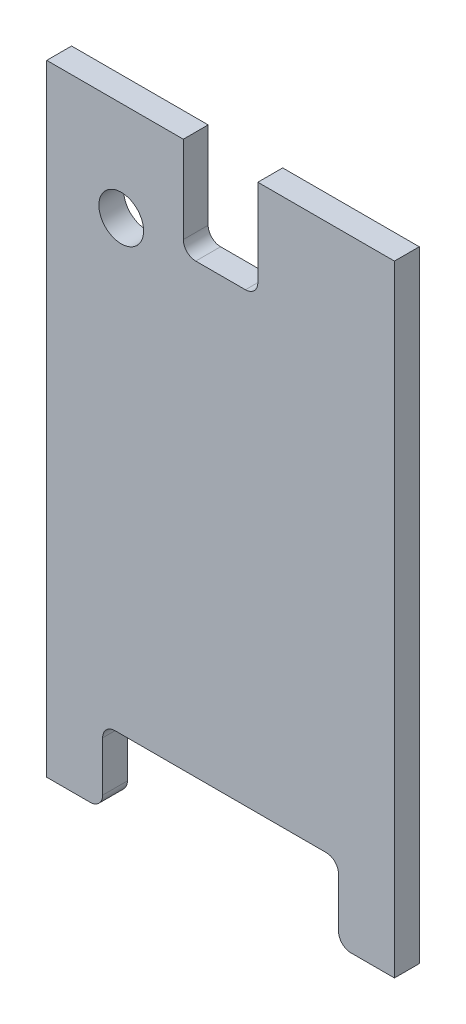
ISO-10303-21;
HEADER;
FILE_DESCRIPTION(('STEP AP214'),'2;1');
FILE_NAME('part.step','',(''),(''),'','','');
FILE_SCHEMA(('AUTOMOTIVE_DESIGN { 1 0 10303 214 1 1 1 1 }'));
ENDSEC;
DATA;
#1=APPLICATION_CONTEXT('core data for automotive mechanical design processes');
#2=APPLICATION_PROTOCOL_DEFINITION('international standard','automotive_design',2000,#1);
#3=PRODUCT_CONTEXT('',#1,'mechanical');
#4=PRODUCT('Part','Part','',(#3));
#5=PRODUCT_RELATED_PRODUCT_CATEGORY('part','',(#4));
#6=PRODUCT_DEFINITION_FORMATION('','',#4);
#7=PRODUCT_DEFINITION_CONTEXT('part definition',#1,'design');
#8=PRODUCT_DEFINITION('design','',#6,#7);
#9=PRODUCT_DEFINITION_SHAPE('','',#8);
#10=(LENGTH_UNIT() NAMED_UNIT(*) SI_UNIT(.MILLI.,.METRE.));
#11=(NAMED_UNIT(*) PLANE_ANGLE_UNIT() SI_UNIT($,.RADIAN.));
#12=(NAMED_UNIT(*) SI_UNIT($,.STERADIAN.) SOLID_ANGLE_UNIT());
#13=UNCERTAINTY_MEASURE_WITH_UNIT(LENGTH_MEASURE(1.E-05),#10,'distance_accuracy_value','');
#14=(GEOMETRIC_REPRESENTATION_CONTEXT(3) GLOBAL_UNCERTAINTY_ASSIGNED_CONTEXT((#13)) GLOBAL_UNIT_ASSIGNED_CONTEXT((#10,
#11,#12)) REPRESENTATION_CONTEXT('',''));
#15=CARTESIAN_POINT('',(0.,0.,0.));
#16=DIRECTION('',(0.,0.,1.));
#17=DIRECTION('',(1.,0.,0.));
#18=AXIS2_PLACEMENT_3D('',#15,#16,#17);
#19=CARTESIAN_POINT('',(18.2478223766306,35.623604775,12.7));
#20=DIRECTION('',(0.,0.,1.));
#21=DIRECTION('',(1.,0.,0.));
#22=AXIS2_PLACEMENT_3D('',#19,#20,#21);
#23=PLANE('',#22);
#24=DIRECTION('',(0.,-1.,0.));
#25=VECTOR('',#24,1.);
#26=CARTESIAN_POINT('',(-3.97717762336947,346.773604775,12.7));
#27=LINE('',#26,#25);
#28=CARTESIAN_POINT('',(-3.97717762336947,346.773604775,12.7));
#29=VERTEX_POINT('',#28);
#30=CARTESIAN_POINT('',(-3.97717762336946,29.273604775,12.7));
#31=VERTEX_POINT('',#30);
#32=EDGE_CURVE('E125',#29,#31,#27,.T.);
#33=ORIENTED_EDGE('',*,*,#32,.T.);
#34=DIRECTION('',(1.,0.,0.));
#35=VECTOR('',#34,1.);
#36=CARTESIAN_POINT('',(-3.97717762336946,29.273604775,12.7));
#37=LINE('',#36,#35);
#38=CARTESIAN_POINT('',(18.2478223766306,29.273604775,12.7));
#39=VERTEX_POINT('',#38);
#40=EDGE_CURVE('E328',#31,#39,#37,.T.);
#41=ORIENTED_EDGE('',*,*,#40,.T.);
#42=CARTESIAN_POINT('',(18.2478223766306,35.623604775,12.7));
#43=DIRECTION('',(0.,0.,1.));
#44=DIRECTION('',(1.,0.,0.));
#45=AXIS2_PLACEMENT_3D('',#42,#43,#44);
#46=CIRCLE('',#45,6.35);
#47=CARTESIAN_POINT('',(24.5978223766306,35.623604775,12.7));
#48=VERTEX_POINT('',#47);
#49=EDGE_CURVE('E275',#39,#48,#46,.T.);
#50=ORIENTED_EDGE('',*,*,#49,.T.);
#51=DIRECTION('',(0.,1.,0.));
#52=VECTOR('',#51,1.);
#53=CARTESIAN_POINT('',(24.5978223766306,35.623604775,12.7));
#54=LINE('',#53,#52);
#55=CARTESIAN_POINT('',(24.5978223766306,61.023604775,12.7));
#56=VERTEX_POINT('',#55);
#57=EDGE_CURVE('E294',#48,#56,#54,.T.);
#58=ORIENTED_EDGE('',*,*,#57,.T.);
#59=CARTESIAN_POINT('',(30.9478223766306,61.023604775,12.7));
#60=DIRECTION('',(0.,0.,-1.));
#61=DIRECTION('',(-1.,0.,0.));
#62=AXIS2_PLACEMENT_3D('',#59,#60,#61);
#63=CIRCLE('',#62,6.35);
#64=CARTESIAN_POINT('',(30.9478223766306,67.373604775,12.7));
#65=VERTEX_POINT('',#64);
#66=EDGE_CURVE('E291',#56,#65,#63,.T.);
#67=ORIENTED_EDGE('',*,*,#66,.T.);
#68=DIRECTION('',(1.,0.,0.));
#69=VECTOR('',#68,1.);
#70=CARTESIAN_POINT('',(30.9478223766306,67.373604775,12.7));
#71=LINE('',#70,#69);
#72=CARTESIAN_POINT('',(138.897822376631,67.373604775,12.7));
#73=VERTEX_POINT('',#72);
#74=EDGE_CURVE('E293',#65,#73,#71,.T.);
#75=ORIENTED_EDGE('',*,*,#74,.T.);
#76=CARTESIAN_POINT('',(138.897822376631,61.023604775,12.7));
#77=DIRECTION('',(0.,0.,-1.));
#78=DIRECTION('',(-1.,0.,0.));
#79=AXIS2_PLACEMENT_3D('',#76,#77,#78);
#80=CIRCLE('',#79,6.34999999999998);
#81=CARTESIAN_POINT('',(145.247822376631,61.023604775,12.7));
#82=VERTEX_POINT('',#81);
#83=EDGE_CURVE('E296',#73,#82,#80,.T.);
#84=ORIENTED_EDGE('',*,*,#83,.T.);
#85=DIRECTION('',(0.,-1.,0.));
#86=VECTOR('',#85,1.);
#87=CARTESIAN_POINT('',(145.247822376631,35.623604775,12.7));
#88=LINE('',#87,#86);
#89=CARTESIAN_POINT('',(145.247822376631,35.623604775,12.7));
#90=VERTEX_POINT('',#89);
#91=EDGE_CURVE('E302',#82,#90,#88,.T.);
#92=ORIENTED_EDGE('',*,*,#91,.T.);
#93=CARTESIAN_POINT('',(151.597822376631,35.623604775,12.7));
#94=DIRECTION('',(0.,0.,1.));
#95=DIRECTION('',(-1.,0.,0.));
#96=AXIS2_PLACEMENT_3D('',#93,#94,#95);
#97=CIRCLE('',#96,6.34999999999998);
#98=CARTESIAN_POINT('',(151.597822376631,29.273604775,12.7));
#99=VERTEX_POINT('',#98);
#100=EDGE_CURVE('E304',#90,#99,#97,.T.);
#101=ORIENTED_EDGE('',*,*,#100,.T.);
#102=DIRECTION('',(1.,0.,0.));
#103=VECTOR('',#102,1.);
#104=CARTESIAN_POINT('',(151.597822376631,29.273604775,12.7));
#105=LINE('',#104,#103);
#106=CARTESIAN_POINT('',(173.822822376631,29.273604775,12.7));
#107=VERTEX_POINT('',#106);
#108=EDGE_CURVE('E306',#99,#107,#105,.T.);
#109=ORIENTED_EDGE('',*,*,#108,.T.);
#110=DIRECTION('',(0.,1.,0.));
#111=VECTOR('',#110,1.);
#112=CARTESIAN_POINT('',(173.822822376631,35.623604775,12.7));
#113=LINE('',#112,#111);
#114=CARTESIAN_POINT('',(173.82282237663,346.773604775,12.7));
#115=VERTEX_POINT('',#114);
#116=EDGE_CURVE('E308',#107,#115,#113,.T.);
#117=ORIENTED_EDGE('',*,*,#116,.T.);
#118=DIRECTION('',(-1.,0.,0.));
#119=VECTOR('',#118,1.);
#120=CARTESIAN_POINT('',(103.972822376631,346.773604775,12.7));
#121=LINE('',#120,#119);
#122=CARTESIAN_POINT('',(103.972822376631,346.773604775,12.7));
#123=VERTEX_POINT('',#122);
#124=EDGE_CURVE('E310',#115,#123,#121,.T.);
#125=ORIENTED_EDGE('',*,*,#124,.T.);
#126=DIRECTION('',(0.,-1.,0.));
#127=VECTOR('',#126,1.);
#128=CARTESIAN_POINT('',(103.972822376631,346.773604775,12.7));
#129=LINE('',#128,#127);
#130=CARTESIAN_POINT('',(103.972822376631,302.323604775,12.7));
#131=VERTEX_POINT('',#130);
#132=EDGE_CURVE('E312',#123,#131,#129,.T.);
#133=ORIENTED_EDGE('',*,*,#132,.T.);
#134=CARTESIAN_POINT('',(97.6228223766306,302.323604775,12.7));
#135=DIRECTION('',(0.,0.,-1.));
#136=DIRECTION('',(1.,0.,0.));
#137=AXIS2_PLACEMENT_3D('',#134,#135,#136);
#138=CIRCLE('',#137,6.35000000000001);
#139=CARTESIAN_POINT('',(97.6228223766306,295.973604775,12.7));
#140=VERTEX_POINT('',#139);
#141=EDGE_CURVE('E314',#131,#140,#138,.T.);
#142=ORIENTED_EDGE('',*,*,#141,.T.);
#143=DIRECTION('',(-1.,0.,0.));
#144=VECTOR('',#143,1.);
#145=CARTESIAN_POINT('',(72.2228223766305,295.973604775,12.7));
#146=LINE('',#145,#144);
#147=CARTESIAN_POINT('',(72.2228223766305,295.973604775,12.7));
#148=VERTEX_POINT('',#147);
#149=EDGE_CURVE('E175',#140,#148,#146,.T.);
#150=ORIENTED_EDGE('',*,*,#149,.T.);
#151=CARTESIAN_POINT('',(72.2228223766305,302.323604775,12.7));
#152=DIRECTION('',(0.,0.,-1.));
#153=DIRECTION('',(1.,0.,0.));
#154=AXIS2_PLACEMENT_3D('',#151,#152,#153);
#155=CIRCLE('',#154,6.35000000000001);
#156=CARTESIAN_POINT('',(65.8728223766305,302.323604775,12.7));
#157=VERTEX_POINT('',#156);
#158=EDGE_CURVE('E169',#148,#157,#155,.T.);
#159=ORIENTED_EDGE('',*,*,#158,.T.);
#160=DIRECTION('',(0.,1.,0.));
#161=VECTOR('',#160,1.);
#162=CARTESIAN_POINT('',(65.8728223766305,346.773604775,12.7));
#163=LINE('',#162,#161);
#164=CARTESIAN_POINT('',(65.8728223766305,346.773604775,12.7));
#165=VERTEX_POINT('',#164);
#166=EDGE_CURVE('E173',#157,#165,#163,.T.);
#167=ORIENTED_EDGE('',*,*,#166,.T.);
#168=DIRECTION('',(-1.,0.,0.));
#169=VECTOR('',#168,1.);
#170=CARTESIAN_POINT('',(-3.97717762336947,346.773604775,12.7));
#171=LINE('',#170,#169);
#172=EDGE_CURVE('E53',#165,#29,#171,.T.);
#173=ORIENTED_EDGE('',*,*,#172,.T.);
#174=EDGE_LOOP('',(#33,#41,#50,#58,#67,#75,#84,#92,#101,#109,#117,#125,#133,#142,#150,#159,#167,#173));
#175=FACE_BOUND('',#174,.T.);
#176=CARTESIAN_POINT('',(34.1228223766306,295.973604775,12.7));
#177=DIRECTION('',(0.,0.,1.));
#178=DIRECTION('',(1.,0.,0.));
#179=AXIS2_PLACEMENT_3D('',#176,#177,#178);
#180=CIRCLE('',#179,11.43);
#181=CARTESIAN_POINT('',(45.5528223766306,295.973604775,12.7));
#182=VERTEX_POINT('',#181);
#183=EDGE_CURVE('E195',#182,#182,#180,.T.);
#184=ORIENTED_EDGE('',*,*,#183,.F.);
#185=EDGE_LOOP('',(#184));
#186=FACE_BOUND('',#185,.T.);
#187=ADVANCED_FACE('F36',(#175,#186),#23,.T.);
#188=CARTESIAN_POINT('',(18.2478223766306,35.623604775,0.));
#189=DIRECTION('',(0.,0.,1.));
#190=DIRECTION('',(1.,0.,0.));
#191=AXIS2_PLACEMENT_3D('',#188,#189,#190);
#192=PLANE('',#191);
#193=DIRECTION('',(0.,-1.,0.));
#194=VECTOR('',#193,1.);
#195=CARTESIAN_POINT('',(-3.97717762336946,35.623604775,0.));
#196=LINE('',#195,#194);
#197=CARTESIAN_POINT('',(-3.97717762336947,346.773604775,0.));
#198=VERTEX_POINT('',#197);
#199=CARTESIAN_POINT('',(-3.97717762336946,29.273604775,0.));
#200=VERTEX_POINT('',#199);
#201=EDGE_CURVE('E119',#198,#200,#196,.T.);
#202=ORIENTED_EDGE('',*,*,#201,.F.);
#203=DIRECTION('',(-1.,0.,0.));
#204=VECTOR('',#203,1.);
#205=CARTESIAN_POINT('',(-3.97717762336947,346.773604775,0.));
#206=LINE('',#205,#204);
#207=CARTESIAN_POINT('',(65.8728223766305,346.773604775,0.));
#208=VERTEX_POINT('',#207);
#209=EDGE_CURVE('E227',#208,#198,#206,.T.);
#210=ORIENTED_EDGE('',*,*,#209,.F.);
#211=DIRECTION('',(0.,1.,0.));
#212=VECTOR('',#211,1.);
#213=CARTESIAN_POINT('',(65.8728223766305,346.773604775,0.));
#214=LINE('',#213,#212);
#215=CARTESIAN_POINT('',(65.8728223766305,302.323604775,0.));
#216=VERTEX_POINT('',#215);
#217=EDGE_CURVE('E112',#216,#208,#214,.T.);
#218=ORIENTED_EDGE('',*,*,#217,.F.);
#219=CARTESIAN_POINT('',(72.2228223766305,302.323604775,0.));
#220=DIRECTION('',(0.,0.,-1.));
#221=DIRECTION('',(1.,0.,0.));
#222=AXIS2_PLACEMENT_3D('',#219,#220,#221);
#223=CIRCLE('',#222,6.35000000000001);
#224=CARTESIAN_POINT('',(72.2228223766305,295.973604775,0.));
#225=VERTEX_POINT('',#224);
#226=EDGE_CURVE('E183',#225,#216,#223,.T.);
#227=ORIENTED_EDGE('',*,*,#226,.F.);
#228=DIRECTION('',(-1.,0.,0.));
#229=VECTOR('',#228,1.);
#230=CARTESIAN_POINT('',(72.2228223766305,295.973604775,0.));
#231=LINE('',#230,#229);
#232=CARTESIAN_POINT('',(97.6228223766306,295.973604775,0.));
#233=VERTEX_POINT('',#232);
#234=EDGE_CURVE('E223',#233,#225,#231,.T.);
#235=ORIENTED_EDGE('',*,*,#234,.F.);
#236=CARTESIAN_POINT('',(97.6228223766306,302.323604775,0.));
#237=DIRECTION('',(0.,0.,-1.));
#238=DIRECTION('',(1.,0.,0.));
#239=AXIS2_PLACEMENT_3D('',#236,#237,#238);
#240=CIRCLE('',#239,6.35000000000001);
#241=CARTESIAN_POINT('',(103.972822376631,302.323604775,0.));
#242=VERTEX_POINT('',#241);
#243=EDGE_CURVE('E221',#242,#233,#240,.T.);
#244=ORIENTED_EDGE('',*,*,#243,.F.);
#245=DIRECTION('',(0.,-1.,0.));
#246=VECTOR('',#245,1.);
#247=CARTESIAN_POINT('',(103.972822376631,346.773604775,0.));
#248=LINE('',#247,#246);
#249=CARTESIAN_POINT('',(103.972822376631,346.773604775,0.));
#250=VERTEX_POINT('',#249);
#251=EDGE_CURVE('E219',#250,#242,#248,.T.);
#252=ORIENTED_EDGE('',*,*,#251,.F.);
#253=DIRECTION('',(-1.,0.,0.));
#254=VECTOR('',#253,1.);
#255=CARTESIAN_POINT('',(103.972822376631,346.773604775,0.));
#256=LINE('',#255,#254);
#257=CARTESIAN_POINT('',(173.82282237663,346.773604775,0.));
#258=VERTEX_POINT('',#257);
#259=EDGE_CURVE('E217',#258,#250,#256,.T.);
#260=ORIENTED_EDGE('',*,*,#259,.F.);
#261=DIRECTION('',(0.,1.,0.));
#262=VECTOR('',#261,1.);
#263=CARTESIAN_POINT('',(173.82282237663,346.773604775,0.));
#264=LINE('',#263,#262);
#265=CARTESIAN_POINT('',(173.822822376631,29.273604775,0.));
#266=VERTEX_POINT('',#265);
#267=EDGE_CURVE('E215',#266,#258,#264,.T.);
#268=ORIENTED_EDGE('',*,*,#267,.F.);
#269=DIRECTION('',(1.,0.,0.));
#270=VECTOR('',#269,1.);
#271=CARTESIAN_POINT('',(173.822822376631,29.273604775,0.));
#272=LINE('',#271,#270);
#273=CARTESIAN_POINT('',(151.597822376631,29.273604775,0.));
#274=VERTEX_POINT('',#273);
#275=EDGE_CURVE('E212',#274,#266,#272,.T.);
#276=ORIENTED_EDGE('',*,*,#275,.F.);
#277=CARTESIAN_POINT('',(151.597822376631,35.623604775,0.));
#278=DIRECTION('',(0.,0.,1.));
#279=DIRECTION('',(-1.,0.,0.));
#280=AXIS2_PLACEMENT_3D('',#277,#278,#279);
#281=CIRCLE('',#280,6.34999999999998);
#282=CARTESIAN_POINT('',(145.247822376631,35.623604775,0.));
#283=VERTEX_POINT('',#282);
#284=EDGE_CURVE('E209',#283,#274,#281,.T.);
#285=ORIENTED_EDGE('',*,*,#284,.F.);
#286=DIRECTION('',(0.,-1.,0.));
#287=VECTOR('',#286,1.);
#288=CARTESIAN_POINT('',(145.247822376631,35.623604775,0.));
#289=LINE('',#288,#287);
#290=CARTESIAN_POINT('',(145.247822376631,61.023604775,0.));
#291=VERTEX_POINT('',#290);
#292=EDGE_CURVE('E207',#291,#283,#289,.T.);
#293=ORIENTED_EDGE('',*,*,#292,.F.);
#294=CARTESIAN_POINT('',(138.897822376631,61.023604775,0.));
#295=DIRECTION('',(0.,0.,-1.));
#296=DIRECTION('',(-1.,0.,0.));
#297=AXIS2_PLACEMENT_3D('',#294,#295,#296);
#298=CIRCLE('',#297,6.34999999999998);
#299=CARTESIAN_POINT('',(138.897822376631,67.373604775,0.));
#300=VERTEX_POINT('',#299);
#301=EDGE_CURVE('E205',#300,#291,#298,.T.);
#302=ORIENTED_EDGE('',*,*,#301,.F.);
#303=DIRECTION('',(1.,0.,0.));
#304=VECTOR('',#303,1.);
#305=CARTESIAN_POINT('',(30.9478223766306,67.373604775,0.));
#306=LINE('',#305,#304);
#307=CARTESIAN_POINT('',(30.9478223766306,67.373604775,0.));
#308=VERTEX_POINT('',#307);
#309=EDGE_CURVE('E203',#308,#300,#306,.T.);
#310=ORIENTED_EDGE('',*,*,#309,.F.);
#311=CARTESIAN_POINT('',(30.9478223766306,61.023604775,0.));
#312=DIRECTION('',(0.,0.,-1.));
#313=DIRECTION('',(-1.,0.,0.));
#314=AXIS2_PLACEMENT_3D('',#311,#312,#313);
#315=CIRCLE('',#314,6.35);
#316=CARTESIAN_POINT('',(24.5978223766306,61.023604775,0.));
#317=VERTEX_POINT('',#316);
#318=EDGE_CURVE('E201',#317,#308,#315,.T.);
#319=ORIENTED_EDGE('',*,*,#318,.F.);
#320=DIRECTION('',(0.,1.,0.));
#321=VECTOR('',#320,1.);
#322=CARTESIAN_POINT('',(24.5978223766306,35.623604775,0.));
#323=LINE('',#322,#321);
#324=CARTESIAN_POINT('',(24.5978223766306,35.623604775,0.));
#325=VERTEX_POINT('',#324);
#326=EDGE_CURVE('E199',#325,#317,#323,.T.);
#327=ORIENTED_EDGE('',*,*,#326,.F.);
#328=CARTESIAN_POINT('',(18.2478223766306,35.623604775,0.));
#329=DIRECTION('',(0.,0.,1.));
#330=DIRECTION('',(1.,0.,0.));
#331=AXIS2_PLACEMENT_3D('',#328,#329,#330);
#332=CIRCLE('',#331,6.35);
#333=CARTESIAN_POINT('',(18.2478223766306,29.273604775,0.));
#334=VERTEX_POINT('',#333);
#335=EDGE_CURVE('E197',#334,#325,#332,.T.);
#336=ORIENTED_EDGE('',*,*,#335,.F.);
#337=DIRECTION('',(1.,0.,0.));
#338=VECTOR('',#337,1.);
#339=CARTESIAN_POINT('',(2.37282237663059,29.273604775,0.));
#340=LINE('',#339,#338);
#341=EDGE_CURVE('E194',#200,#334,#340,.T.);
#342=ORIENTED_EDGE('',*,*,#341,.F.);
#343=EDGE_LOOP('',(#202,#210,#218,#227,#235,#244,#252,#260,#268,#276,#285,#293,#302,#310,#319,
#327,#336,#342));
#344=FACE_BOUND('',#343,.T.);
#345=CARTESIAN_POINT('',(34.1228223766306,295.973604775,0.));
#346=DIRECTION('',(0.,0.,1.));
#347=DIRECTION('',(1.,0.,0.));
#348=AXIS2_PLACEMENT_3D('',#345,#346,#347);
#349=CIRCLE('',#348,11.43);
#350=CARTESIAN_POINT('',(45.5528223766306,295.973604775,0.));
#351=VERTEX_POINT('',#350);
#352=EDGE_CURVE('E332',#351,#351,#349,.T.);
#353=ORIENTED_EDGE('',*,*,#352,.T.);
#354=EDGE_LOOP('',(#353));
#355=FACE_BOUND('',#354,.T.);
#356=ADVANCED_FACE('F279',(#344,#355),#192,.F.);
#357=CARTESIAN_POINT('',(-3.97717762336946,35.623604775,12.7));
#358=DIRECTION('',(1.,0.,0.));
#359=DIRECTION('',(0.,1.,0.));
#360=AXIS2_PLACEMENT_3D('',#357,#358,#359);
#361=PLANE('',#360);
#362=ORIENTED_EDGE('',*,*,#201,.T.);
#363=DIRECTION('',(0.,0.,-1.));
#364=VECTOR('',#363,1.);
#365=CARTESIAN_POINT('',(-3.97717762336946,29.273604775,12.7));
#366=LINE('',#365,#364);
#367=EDGE_CURVE('E11',#31,#200,#366,.T.);
#368=ORIENTED_EDGE('',*,*,#367,.F.);
#369=ORIENTED_EDGE('',*,*,#32,.F.);
#370=DIRECTION('',(0.,0.,-1.));
#371=VECTOR('',#370,1.);
#372=CARTESIAN_POINT('',(-3.97717762336947,346.773604775,12.7));
#373=LINE('',#372,#371);
#374=EDGE_CURVE('E189',#29,#198,#373,.T.);
#375=ORIENTED_EDGE('',*,*,#374,.T.);
#376=EDGE_LOOP('',(#362,#368,#369,#375));
#377=FACE_BOUND('',#376,.T.);
#378=ADVANCED_FACE('F38',(#377),#361,.F.);
#379=CARTESIAN_POINT('',(2.37282237663059,29.273604775,12.7));
#380=DIRECTION('',(0.,1.,0.));
#381=DIRECTION('',(0.,0.,1.));
#382=AXIS2_PLACEMENT_3D('',#379,#380,#381);
#383=PLANE('',#382);
#384=ORIENTED_EDGE('',*,*,#341,.T.);
#385=DIRECTION('',(0.,0.,-1.));
#386=VECTOR('',#385,1.);
#387=CARTESIAN_POINT('',(18.2478223766306,29.273604775,12.7));
#388=LINE('',#387,#386);
#389=EDGE_CURVE('E45',#39,#334,#388,.T.);
#390=ORIENTED_EDGE('',*,*,#389,.F.);
#391=ORIENTED_EDGE('',*,*,#40,.F.);
#392=ORIENTED_EDGE('',*,*,#367,.T.);
#393=EDGE_LOOP('',(#384,#390,#391,#392));
#394=FACE_BOUND('',#393,.T.);
#395=ADVANCED_FACE('F334',(#394),#383,.F.);
#396=CARTESIAN_POINT('',(18.2478223766306,35.623604775,12.7));
#397=DIRECTION('',(0.,0.,-1.));
#398=DIRECTION('',(-1.,0.,0.));
#399=AXIS2_PLACEMENT_3D('',#396,#397,#398);
#400=CYLINDRICAL_SURFACE('',#399,6.35);
#401=ORIENTED_EDGE('',*,*,#335,.T.);
#402=DIRECTION('',(0.,0.,-1.));
#403=VECTOR('',#402,1.);
#404=CARTESIAN_POINT('',(24.5978223766306,35.623604775,12.7));
#405=LINE('',#404,#403);
#406=EDGE_CURVE('E266',#48,#325,#405,.T.);
#407=ORIENTED_EDGE('',*,*,#406,.F.);
#408=ORIENTED_EDGE('',*,*,#49,.F.);
#409=ORIENTED_EDGE('',*,*,#389,.T.);
#410=EDGE_LOOP('',(#401,#407,#408,#409));
#411=FACE_BOUND('',#410,.T.);
#412=ADVANCED_FACE('F273',(#411),#400,.T.);
#413=CARTESIAN_POINT('',(24.5978223766306,35.623604775,12.7));
#414=DIRECTION('',(-1.,0.,0.));
#415=DIRECTION('',(0.,0.,1.));
#416=AXIS2_PLACEMENT_3D('',#413,#414,#415);
#417=PLANE('',#416);
#418=ORIENTED_EDGE('',*,*,#326,.T.);
#419=DIRECTION('',(0.,0.,-1.));
#420=VECTOR('',#419,1.);
#421=CARTESIAN_POINT('',(24.5978223766306,61.023604775,12.7));
#422=LINE('',#421,#420);
#423=EDGE_CURVE('E263',#56,#317,#422,.T.);
#424=ORIENTED_EDGE('',*,*,#423,.F.);
#425=ORIENTED_EDGE('',*,*,#57,.F.);
#426=ORIENTED_EDGE('',*,*,#406,.T.);
#427=EDGE_LOOP('',(#418,#424,#425,#426));
#428=FACE_BOUND('',#427,.T.);
#429=ADVANCED_FACE('F285',(#428),#417,.F.);
#430=CARTESIAN_POINT('',(30.9478223766306,61.023604775,12.7));
#431=DIRECTION('',(0.,0.,-1.));
#432=DIRECTION('',(-1.,0.,0.));
#433=AXIS2_PLACEMENT_3D('',#430,#431,#432);
#434=CYLINDRICAL_SURFACE('',#433,6.35);
#435=ORIENTED_EDGE('',*,*,#318,.T.);
#436=DIRECTION('',(0.,0.,-1.));
#437=VECTOR('',#436,1.);
#438=CARTESIAN_POINT('',(30.9478223766306,67.373604775,12.7));
#439=LINE('',#438,#437);
#440=EDGE_CURVE('E260',#65,#308,#439,.T.);
#441=ORIENTED_EDGE('',*,*,#440,.F.);
#442=ORIENTED_EDGE('',*,*,#66,.F.);
#443=ORIENTED_EDGE('',*,*,#423,.T.);
#444=EDGE_LOOP('',(#435,#441,#442,#443));
#445=FACE_BOUND('',#444,.T.);
#446=ADVANCED_FACE('F289',(#445),#434,.F.);
#447=CARTESIAN_POINT('',(30.9478223766306,67.373604775,12.7));
#448=DIRECTION('',(0.,1.,0.));
#449=DIRECTION('',(-1.,0.,0.));
#450=AXIS2_PLACEMENT_3D('',#447,#448,#449);
#451=PLANE('',#450);
#452=ORIENTED_EDGE('',*,*,#309,.T.);
#453=DIRECTION('',(0.,0.,-1.));
#454=VECTOR('',#453,1.);
#455=CARTESIAN_POINT('',(138.897822376631,67.373604775,12.7));
#456=LINE('',#455,#454);
#457=EDGE_CURVE('E257',#73,#300,#456,.T.);
#458=ORIENTED_EDGE('',*,*,#457,.F.);
#459=ORIENTED_EDGE('',*,*,#74,.F.);
#460=ORIENTED_EDGE('',*,*,#440,.T.);
#461=EDGE_LOOP('',(#452,#458,#459,#460));
#462=FACE_BOUND('',#461,.T.);
#463=ADVANCED_FACE('F387',(#462),#451,.F.);
#464=CARTESIAN_POINT('',(138.897822376631,61.023604775,12.7));
#465=DIRECTION('',(0.,0.,-1.));
#466=DIRECTION('',(-1.,0.,0.));
#467=AXIS2_PLACEMENT_3D('',#464,#465,#466);
#468=CYLINDRICAL_SURFACE('',#467,6.34999999999998);
#469=ORIENTED_EDGE('',*,*,#301,.T.);
#470=DIRECTION('',(0.,0.,-1.));
#471=VECTOR('',#470,1.);
#472=CARTESIAN_POINT('',(145.247822376631,61.023604775,12.7));
#473=LINE('',#472,#471);
#474=EDGE_CURVE('E254',#82,#291,#473,.T.);
#475=ORIENTED_EDGE('',*,*,#474,.F.);
#476=ORIENTED_EDGE('',*,*,#83,.F.);
#477=ORIENTED_EDGE('',*,*,#457,.T.);
#478=EDGE_LOOP('',(#469,#475,#476,#477));
#479=FACE_BOUND('',#478,.T.);
#480=ADVANCED_FACE('F383',(#479),#468,.F.);
#481=CARTESIAN_POINT('',(145.247822376631,35.623604775,12.7));
#482=DIRECTION('',(1.,0.,0.));
#483=DIRECTION('',(0.,1.,0.));
#484=AXIS2_PLACEMENT_3D('',#481,#482,#483);
#485=PLANE('',#484);
#486=ORIENTED_EDGE('',*,*,#292,.T.);
#487=DIRECTION('',(0.,0.,-1.));
#488=VECTOR('',#487,1.);
#489=CARTESIAN_POINT('',(145.247822376631,35.623604775,12.7));
#490=LINE('',#489,#488);
#491=EDGE_CURVE('E251',#90,#283,#490,.T.);
#492=ORIENTED_EDGE('',*,*,#491,.F.);
#493=ORIENTED_EDGE('',*,*,#91,.F.);
#494=ORIENTED_EDGE('',*,*,#474,.T.);
#495=EDGE_LOOP('',(#486,#492,#493,#494));
#496=FACE_BOUND('',#495,.T.);
#497=ADVANCED_FACE('F379',(#496),#485,.F.);
#498=CARTESIAN_POINT('',(151.597822376631,35.623604775,12.7));
#499=DIRECTION('',(0.,0.,-1.));
#500=DIRECTION('',(-1.,0.,0.));
#501=AXIS2_PLACEMENT_3D('',#498,#499,#500);
#502=CYLINDRICAL_SURFACE('',#501,6.34999999999998);
#503=ORIENTED_EDGE('',*,*,#284,.T.);
#504=DIRECTION('',(0.,0.,-1.));
#505=VECTOR('',#504,1.);
#506=CARTESIAN_POINT('',(151.597822376631,29.273604775,12.7));
#507=LINE('',#506,#505);
#508=EDGE_CURVE('E248',#99,#274,#507,.T.);
#509=ORIENTED_EDGE('',*,*,#508,.F.);
#510=ORIENTED_EDGE('',*,*,#100,.F.);
#511=ORIENTED_EDGE('',*,*,#491,.T.);
#512=EDGE_LOOP('',(#503,#509,#510,#511));
#513=FACE_BOUND('',#512,.T.);
#514=ADVANCED_FACE('F375',(#513),#502,.T.);
#515=CARTESIAN_POINT('',(173.822822376631,29.273604775,12.7));
#516=DIRECTION('',(0.,1.,0.));
#517=DIRECTION('',(-1.,0.,0.));
#518=AXIS2_PLACEMENT_3D('',#515,#516,#517);
#519=PLANE('',#518);
#520=ORIENTED_EDGE('',*,*,#275,.T.);
#521=DIRECTION('',(0.,0.,-1.));
#522=VECTOR('',#521,1.);
#523=CARTESIAN_POINT('',(173.822822376631,29.273604775,12.7));
#524=LINE('',#523,#522);
#525=EDGE_CURVE('E245',#107,#266,#524,.T.);
#526=ORIENTED_EDGE('',*,*,#525,.F.);
#527=ORIENTED_EDGE('',*,*,#108,.F.);
#528=ORIENTED_EDGE('',*,*,#508,.T.);
#529=EDGE_LOOP('',(#520,#526,#527,#528));
#530=FACE_BOUND('',#529,.T.);
#531=ADVANCED_FACE('F371',(#530),#519,.F.);
#532=CARTESIAN_POINT('',(173.82282237663,346.773604775,12.7));
#533=DIRECTION('',(-1.,0.,0.));
#534=DIRECTION('',(0.,-1.,0.));
#535=AXIS2_PLACEMENT_3D('',#532,#533,#534);
#536=PLANE('',#535);
#537=ORIENTED_EDGE('',*,*,#267,.T.);
#538=DIRECTION('',(0.,0.,-1.));
#539=VECTOR('',#538,1.);
#540=CARTESIAN_POINT('',(173.82282237663,346.773604775,12.7));
#541=LINE('',#540,#539);
#542=EDGE_CURVE('E242',#115,#258,#541,.T.);
#543=ORIENTED_EDGE('',*,*,#542,.F.);
#544=ORIENTED_EDGE('',*,*,#116,.F.);
#545=ORIENTED_EDGE('',*,*,#525,.T.);
#546=EDGE_LOOP('',(#537,#543,#544,#545));
#547=FACE_BOUND('',#546,.T.);
#548=ADVANCED_FACE('F367',(#547),#536,.F.);
#549=CARTESIAN_POINT('',(103.972822376631,346.773604775,12.7));
#550=DIRECTION('',(0.,-1.,0.));
#551=DIRECTION('',(0.,0.,-1.));
#552=AXIS2_PLACEMENT_3D('',#549,#550,#551);
#553=PLANE('',#552);
#554=ORIENTED_EDGE('',*,*,#259,.T.);
#555=DIRECTION('',(0.,0.,-1.));
#556=VECTOR('',#555,1.);
#557=CARTESIAN_POINT('',(103.972822376631,346.773604775,12.7));
#558=LINE('',#557,#556);
#559=EDGE_CURVE('E239',#123,#250,#558,.T.);
#560=ORIENTED_EDGE('',*,*,#559,.F.);
#561=ORIENTED_EDGE('',*,*,#124,.F.);
#562=ORIENTED_EDGE('',*,*,#542,.T.);
#563=EDGE_LOOP('',(#554,#560,#561,#562));
#564=FACE_BOUND('',#563,.T.);
#565=ADVANCED_FACE('F363',(#564),#553,.F.);
#566=CARTESIAN_POINT('',(103.972822376631,346.773604775,12.7));
#567=DIRECTION('',(1.,0.,0.));
#568=DIRECTION('',(0.,0.,-1.));
#569=AXIS2_PLACEMENT_3D('',#566,#567,#568);
#570=PLANE('',#569);
#571=ORIENTED_EDGE('',*,*,#251,.T.);
#572=DIRECTION('',(0.,0.,-1.));
#573=VECTOR('',#572,1.);
#574=CARTESIAN_POINT('',(103.972822376631,302.323604775,12.7));
#575=LINE('',#574,#573);
#576=EDGE_CURVE('E236',#131,#242,#575,.T.);
#577=ORIENTED_EDGE('',*,*,#576,.F.);
#578=ORIENTED_EDGE('',*,*,#132,.F.);
#579=ORIENTED_EDGE('',*,*,#559,.T.);
#580=EDGE_LOOP('',(#571,#577,#578,#579));
#581=FACE_BOUND('',#580,.T.);
#582=ADVANCED_FACE('F360',(#581),#570,.F.);
#583=CARTESIAN_POINT('',(97.6228223766306,302.323604775,12.7));
#584=DIRECTION('',(0.,0.,-1.));
#585=DIRECTION('',(-1.,0.,0.));
#586=AXIS2_PLACEMENT_3D('',#583,#584,#585);
#587=CYLINDRICAL_SURFACE('',#586,6.35000000000001);
#588=ORIENTED_EDGE('',*,*,#243,.T.);
#589=DIRECTION('',(0.,0.,-1.));
#590=VECTOR('',#589,1.);
#591=CARTESIAN_POINT('',(97.6228223766306,295.973604775,12.7));
#592=LINE('',#591,#590);
#593=EDGE_CURVE('E233',#140,#233,#592,.T.);
#594=ORIENTED_EDGE('',*,*,#593,.F.);
#595=ORIENTED_EDGE('',*,*,#141,.F.);
#596=ORIENTED_EDGE('',*,*,#576,.T.);
#597=EDGE_LOOP('',(#588,#594,#595,#596));
#598=FACE_BOUND('',#597,.T.);
#599=ADVANCED_FACE('F320',(#598),#587,.F.);
#600=CARTESIAN_POINT('',(72.2228223766305,295.973604775,12.7));
#601=DIRECTION('',(0.,-1.,0.));
#602=DIRECTION('',(0.,0.,-1.));
#603=AXIS2_PLACEMENT_3D('',#600,#601,#602);
#604=PLANE('',#603);
#605=ORIENTED_EDGE('',*,*,#234,.T.);
#606=DIRECTION('',(0.,0.,-1.));
#607=VECTOR('',#606,1.);
#608=CARTESIAN_POINT('',(72.2228223766305,295.973604775,12.7));
#609=LINE('',#608,#607);
#610=EDGE_CURVE('E184',#148,#225,#609,.T.);
#611=ORIENTED_EDGE('',*,*,#610,.F.);
#612=ORIENTED_EDGE('',*,*,#149,.F.);
#613=ORIENTED_EDGE('',*,*,#593,.T.);
#614=EDGE_LOOP('',(#605,#611,#612,#613));
#615=FACE_BOUND('',#614,.T.);
#616=ADVANCED_FACE('F324',(#615),#604,.F.);
#617=CARTESIAN_POINT('',(72.2228223766305,302.323604775,12.7));
#618=DIRECTION('',(0.,0.,-1.));
#619=DIRECTION('',(-1.,0.,0.));
#620=AXIS2_PLACEMENT_3D('',#617,#618,#619);
#621=CYLINDRICAL_SURFACE('',#620,6.35000000000001);
#622=ORIENTED_EDGE('',*,*,#226,.T.);
#623=DIRECTION('',(0.,0.,-1.));
#624=VECTOR('',#623,1.);
#625=CARTESIAN_POINT('',(65.8728223766305,302.323604775,12.7));
#626=LINE('',#625,#624);
#627=EDGE_CURVE('E180',#157,#216,#626,.T.);
#628=ORIENTED_EDGE('',*,*,#627,.F.);
#629=ORIENTED_EDGE('',*,*,#158,.F.);
#630=ORIENTED_EDGE('',*,*,#610,.T.);
#631=EDGE_LOOP('',(#622,#628,#629,#630));
#632=FACE_BOUND('',#631,.T.);
#633=ADVANCED_FACE('F181',(#632),#621,.F.);
#634=CARTESIAN_POINT('',(65.8728223766305,346.773604775,12.7));
#635=DIRECTION('',(-1.,0.,0.));
#636=DIRECTION('',(0.,-1.,0.));
#637=AXIS2_PLACEMENT_3D('',#634,#635,#636);
#638=PLANE('',#637);
#639=ORIENTED_EDGE('',*,*,#217,.T.);
#640=DIRECTION('',(0.,0.,-1.));
#641=VECTOR('',#640,1.);
#642=CARTESIAN_POINT('',(65.8728223766305,346.773604775,12.7));
#643=LINE('',#642,#641);
#644=EDGE_CURVE('E185',#165,#208,#643,.T.);
#645=ORIENTED_EDGE('',*,*,#644,.F.);
#646=ORIENTED_EDGE('',*,*,#166,.F.);
#647=ORIENTED_EDGE('',*,*,#627,.T.);
#648=EDGE_LOOP('',(#639,#645,#646,#647));
#649=FACE_BOUND('',#648,.T.);
#650=ADVANCED_FACE('F187',(#649),#638,.F.);
#651=CARTESIAN_POINT('',(-3.97717762336947,346.773604775,12.7));
#652=DIRECTION('',(0.,-1.,0.));
#653=DIRECTION('',(0.,0.,-1.));
#654=AXIS2_PLACEMENT_3D('',#651,#652,#653);
#655=PLANE('',#654);
#656=ORIENTED_EDGE('',*,*,#209,.T.);
#657=ORIENTED_EDGE('',*,*,#374,.F.);
#658=ORIENTED_EDGE('',*,*,#172,.F.);
#659=ORIENTED_EDGE('',*,*,#644,.T.);
#660=EDGE_LOOP('',(#656,#657,#658,#659));
#661=FACE_BOUND('',#660,.T.);
#662=ADVANCED_FACE('F326',(#661),#655,.F.);
#663=CARTESIAN_POINT('',(34.1228223766306,295.973604775,12.7));
#664=DIRECTION('',(0.,0.,-1.));
#665=DIRECTION('',(-1.,0.,0.));
#666=AXIS2_PLACEMENT_3D('',#663,#664,#665);
#667=CYLINDRICAL_SURFACE('',#666,11.43);
#668=ORIENTED_EDGE('',*,*,#183,.T.);
#669=EDGE_LOOP('',(#668));
#670=FACE_BOUND('',#669,.T.);
#671=ORIENTED_EDGE('',*,*,#352,.F.);
#672=EDGE_LOOP('',(#671));
#673=FACE_BOUND('',#672,.T.);
#674=ADVANCED_FACE('F348',(#670,#673),#667,.F.);
#675=CLOSED_SHELL('',(#187,#356,#378,#395,#412,#429,#446,#463,#480,#497,#514,#531,#548,#565,
#582,#599,#616,#633,#650,#662,#674));
#676=MANIFOLD_SOLID_BREP('B2',#675);
#677=ADVANCED_BREP_SHAPE_REPRESENTATION('',(#18,#676),#14);
#678=SHAPE_DEFINITION_REPRESENTATION(#9,#677);
ENDSEC;
END-ISO-10303-21;
